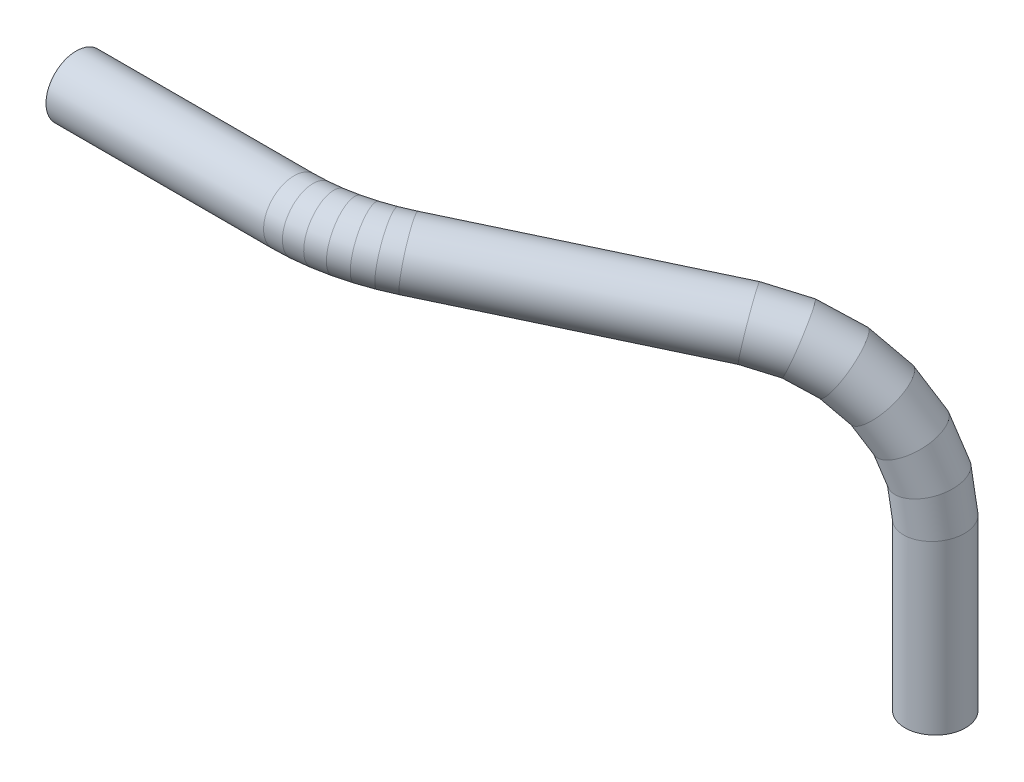
ISO-10303-21;
HEADER;
FILE_DESCRIPTION(('STEP AP214'),'2;1');
FILE_NAME('part.step','',(''),(''),'','','');
FILE_SCHEMA(('AUTOMOTIVE_DESIGN { 1 0 10303 214 1 1 1 1 }'));
ENDSEC;
DATA;
#1=APPLICATION_CONTEXT('core data for automotive mechanical design processes');
#2=APPLICATION_PROTOCOL_DEFINITION('international standard','automotive_design',2000,#1);
#3=PRODUCT_CONTEXT('',#1,'mechanical');
#4=PRODUCT('Part','Part','',(#3));
#5=PRODUCT_RELATED_PRODUCT_CATEGORY('part','',(#4));
#6=PRODUCT_DEFINITION_FORMATION('','',#4);
#7=PRODUCT_DEFINITION_CONTEXT('part definition',#1,'design');
#8=PRODUCT_DEFINITION('design','',#6,#7);
#9=PRODUCT_DEFINITION_SHAPE('','',#8);
#10=(LENGTH_UNIT() NAMED_UNIT(*) SI_UNIT(.MILLI.,.METRE.));
#11=(NAMED_UNIT(*) PLANE_ANGLE_UNIT() SI_UNIT($,.RADIAN.));
#12=(NAMED_UNIT(*) SI_UNIT($,.STERADIAN.) SOLID_ANGLE_UNIT());
#13=UNCERTAINTY_MEASURE_WITH_UNIT(LENGTH_MEASURE(1.E-05),#10,'distance_accuracy_value','');
#14=(GEOMETRIC_REPRESENTATION_CONTEXT(3) GLOBAL_UNCERTAINTY_ASSIGNED_CONTEXT((#13)) GLOBAL_UNIT_ASSIGNED_CONTEXT((#10,
#11,#12)) REPRESENTATION_CONTEXT('',''));
#15=CARTESIAN_POINT('',(0.,0.,0.));
#16=DIRECTION('',(0.,0.,1.));
#17=DIRECTION('',(1.,0.,0.));
#18=AXIS2_PLACEMENT_3D('',#15,#16,#17);
#19=CARTESIAN_POINT('',(125.144076461066,75.7670326342355,0.));
#20=DIRECTION('',(0.,-1.,0.));
#21=DIRECTION('',(0.,0.,-1.));
#22=AXIS2_PLACEMENT_3D('',#19,#20,#21);
#23=CYLINDRICAL_SURFACE('',#22,4.7625);
#24=CARTESIAN_POINT('',(125.144076461066,75.7670326342355,0.));
#25=DIRECTION('',(0.0495415698848754,-0.998178981813304,-0.0344144318491119));
#26=DIRECTION('',(0.819792329710601,0.0603218058926882,-0.569475035345282));
#27=AXIS2_PLACEMENT_3D('',#24,#25,#26);
#28=ELLIPSE('',#27,4.77118842088659,4.7625);
#29=CARTESIAN_POINT('',(129.055460132113,76.0548393360377,-2.7170726946234));
#30=VERTEX_POINT('',#29);
#31=EDGE_CURVE('E66',#30,#30,#28,.F.);
#32=ORIENTED_EDGE('',*,*,#31,.F.);
#33=EDGE_LOOP('',(#32));
#34=FACE_BOUND('',#33,.T.);
#35=CARTESIAN_POINT('',(125.144076461066,49.4,0.));
#36=DIRECTION('',(0.,-1.,0.));
#37=DIRECTION('',(0.,0.,-1.));
#38=AXIS2_PLACEMENT_3D('',#35,#36,#37);
#39=CIRCLE('',#38,4.7625);
#40=CARTESIAN_POINT('',(125.144076461066,49.4,-4.76250000000001));
#41=VERTEX_POINT('',#40);
#42=EDGE_CURVE('E11',#41,#41,#39,.T.);
#43=ORIENTED_EDGE('',*,*,#42,.F.);
#44=EDGE_LOOP('',(#43));
#45=FACE_BOUND('',#44,.T.);
#46=ADVANCED_FACE('F52',(#34,#45),#23,.T.);
#47=CARTESIAN_POINT('',(125.144076461066,75.7670326342355,0.));
#48=DIRECTION('',(0.,-1.,0.));
#49=DIRECTION('',(0.,0.,-1.));
#50=AXIS2_PLACEMENT_3D('',#47,#48,#49);
#51=CYLINDRICAL_SURFACE('',#50,3.8735);
#52=CARTESIAN_POINT('',(125.144076461066,75.7670326342355,0.));
#53=DIRECTION('',(0.0495415698848754,-0.998178981813304,-0.0344144318491119));
#54=DIRECTION('',(0.819792329710601,0.0603218058926882,-0.569475035345282));
#55=AXIS2_PLACEMENT_3D('',#52,#53,#54);
#56=ELLIPSE('',#55,3.88056658232109,3.8735);
#57=CARTESIAN_POINT('',(128.325335180184,76.0011154183679,-2.20988579162703));
#58=VERTEX_POINT('',#57);
#59=EDGE_CURVE('E63',#58,#58,#56,.F.);
#60=ORIENTED_EDGE('',*,*,#59,.T.);
#61=EDGE_LOOP('',(#60));
#62=FACE_BOUND('',#61,.T.);
#63=CARTESIAN_POINT('',(125.144076461066,49.4,0.));
#64=DIRECTION('',(0.,-1.,0.));
#65=DIRECTION('',(0.,0.,-1.));
#66=AXIS2_PLACEMENT_3D('',#63,#64,#65);
#67=CIRCLE('',#66,3.8735);
#68=CARTESIAN_POINT('',(125.144076461066,49.4,-3.87350000000001));
#69=VERTEX_POINT('',#68);
#70=EDGE_CURVE('E60',#69,#69,#67,.T.);
#71=ORIENTED_EDGE('',*,*,#70,.T.);
#72=EDGE_LOOP('',(#71));
#73=FACE_BOUND('',#72,.T.);
#74=ADVANCED_FACE('F54',(#62,#73),#51,.F.);
#75=CARTESIAN_POINT('',(124.57238438886,81.5053145386542,0.397130286814686));
#76=DIRECTION('',(0.0989027075702351,-0.99272255946769,-0.0687035250856597));
#77=DIRECTION('',(0.995073798227724,0.0991369561800745,0.));
#78=AXIS2_PLACEMENT_3D('',#75,#76,#77);
#79=CYLINDRICAL_SURFACE('',#78,3.8735);
#80=CARTESIAN_POINT('',(124.57238438886,81.5053145386542,0.397130286814686));
#81=DIRECTION('',(0.196365897994812,-0.970996160152162,-0.136407078534976));
#82=DIRECTION('',(0.797467406922485,0.239095079350781,-0.553966856343024));
#83=AXIS2_PLACEMENT_3D('',#80,#81,#82);
#84=ELLIPSE('',#83,3.90189581475515,3.8735);
#85=CARTESIAN_POINT('',(127.684019126334,82.4382386281016,-1.76439067146323));
#86=VERTEX_POINT('',#85);
#87=EDGE_CURVE('E71',#86,#86,#84,.T.);
#88=ORIENTED_EDGE('',*,*,#87,.F.);
#89=EDGE_LOOP('',(#88));
#90=FACE_BOUND('',#89,.T.);
#91=ORIENTED_EDGE('',*,*,#59,.F.);
#92=EDGE_LOOP('',(#91));
#93=FACE_BOUND('',#92,.T.);
#94=ADVANCED_FACE('F162',(#90,#93),#79,.F.);
#95=CARTESIAN_POINT('',(124.57238438886,81.5053145386542,0.397130286814686));
#96=DIRECTION('',(0.0989027075702351,-0.99272255946769,-0.0687035250856597));
#97=DIRECTION('',(0.995073798227724,0.0991369561800745,0.));
#98=AXIS2_PLACEMENT_3D('',#95,#96,#97);
#99=CYLINDRICAL_SURFACE('',#98,4.7625);
#100=CARTESIAN_POINT('',(124.57238438886,81.5053145386542,0.397130286814686));
#101=DIRECTION('',(0.196365897994812,-0.970996160152162,-0.136407078534976));
#102=DIRECTION('',(0.797467406922485,0.239095079350781,-0.553966856343024));
#103=AXIS2_PLACEMENT_3D('',#100,#101,#102);
#104=ELLIPSE('',#103,4.79741288699404,4.7625);
#105=CARTESIAN_POINT('',(128.398164803787,82.6523523535485,-2.26047744877291));
#106=VERTEX_POINT('',#105);
#107=EDGE_CURVE('E68',#106,#106,#104,.T.);
#108=ORIENTED_EDGE('',*,*,#107,.T.);
#109=EDGE_LOOP('',(#108));
#110=FACE_BOUND('',#109,.T.);
#111=ORIENTED_EDGE('',*,*,#31,.T.);
#112=EDGE_LOOP('',(#111));
#113=FACE_BOUND('',#112,.T.);
#114=ADVANCED_FACE('F156',(#110,#113),#99,.T.);
#115=CARTESIAN_POINT('',(122.890470702849,86.910732024358,1.56548454078376));
#116=DIRECTION('',(0.290971006128928,-0.935137027211418,-0.202125243179844));
#117=DIRECTION('',(0.954845338969154,0.297103313089707,0.));
#118=AXIS2_PLACEMENT_3D('',#115,#116,#117);
#119=CYLINDRICAL_SURFACE('',#118,4.7625);
#120=CARTESIAN_POINT('',(122.890470702849,86.910732024358,1.56548454078376));
#121=DIRECTION('',(0.381341065875586,-0.885667086060488,-0.264901498950074));
#122=DIRECTION('',(0.727387670005381,0.464320807921769,-0.505285429094309));
#123=AXIS2_PLACEMENT_3D('',#120,#121,#122);
#124=ELLIPSE('',#123,4.79741288699404,4.7625);
#125=CARTESIAN_POINT('',(126.380049684774,89.1382706519813,-0.858578288363592));
#126=VERTEX_POINT('',#125);
#127=EDGE_CURVE('E80',#126,#126,#124,.F.);
#128=ORIENTED_EDGE('',*,*,#127,.F.);
#129=EDGE_LOOP('',(#128));
#130=FACE_BOUND('',#129,.T.);
#131=ORIENTED_EDGE('',*,*,#107,.F.);
#132=EDGE_LOOP('',(#131));
#133=FACE_BOUND('',#132,.T.);
#134=ADVANCED_FACE('F169',(#130,#133),#119,.T.);
#135=CARTESIAN_POINT('',(122.890470702849,86.910732024358,1.56548454078376));
#136=DIRECTION('',(0.290971006128928,-0.935137027211418,-0.202125243179844));
#137=DIRECTION('',(0.954845338969154,0.297103313089707,0.));
#138=AXIS2_PLACEMENT_3D('',#135,#136,#137);
#139=CYLINDRICAL_SURFACE('',#138,3.8735);
#140=CARTESIAN_POINT('',(122.890470702849,86.910732024358,1.56548454078376));
#141=DIRECTION('',(0.381341065875586,-0.885667086060488,-0.264901498950074));
#142=DIRECTION('',(0.727387670005381,0.464320807921769,-0.505285429094309));
#143=AXIS2_PLACEMENT_3D('',#140,#141,#142);
#144=ELLIPSE('',#143,3.90189581475515,3.8735);
#145=CARTESIAN_POINT('',(125.728661608148,88.7224634414917,-0.406086560256087));
#146=VERTEX_POINT('',#145);
#147=EDGE_CURVE('E74',#146,#146,#144,.F.);
#148=ORIENTED_EDGE('',*,*,#147,.T.);
#149=EDGE_LOOP('',(#148));
#150=FACE_BOUND('',#149,.T.);
#151=ORIENTED_EDGE('',*,*,#87,.T.);
#152=EDGE_LOOP('',(#151));
#153=FACE_BOUND('',#152,.T.);
#154=ADVANCED_FACE('F174',(#150,#153),#139,.F.);
#155=CARTESIAN_POINT('',(120.195899313408,91.6697293652146,3.43728924257189));
#156=DIRECTION('',(0.466160751763371,-0.823306365809099,-0.323822144909245));
#157=DIRECTION('',(0.870194192979346,0.492708906460017,0.));
#158=AXIS2_PLACEMENT_3D('',#155,#156,#157);
#159=CYLINDRICAL_SURFACE('',#158,3.8735);
#160=CARTESIAN_POINT('',(120.195899313408,91.6697293652146,3.43728924257189));
#161=DIRECTION('',(0.544195523352243,-0.748962519323615,-0.37802959806317));
#162=DIRECTION('',(0.61511386211202,0.662612363790794,-0.427293566519801));
#163=AXIS2_PLACEMENT_3D('',#160,#161,#162);
#164=ELLIPSE('',#163,3.90189581475515,3.8735);
#165=CARTESIAN_POINT('',(122.596009517581,94.2551737742949,1.77003426369648));
#166=VERTEX_POINT('',#165);
#167=EDGE_CURVE('E82',#166,#166,#164,.T.);
#168=ORIENTED_EDGE('',*,*,#167,.F.);
#169=EDGE_LOOP('',(#168));
#170=FACE_BOUND('',#169,.T.);
#171=ORIENTED_EDGE('',*,*,#147,.F.);
#172=EDGE_LOOP('',(#171));
#173=FACE_BOUND('',#172,.T.);
#174=ADVANCED_FACE('F177',(#170,#173),#159,.F.);
#175=CARTESIAN_POINT('',(120.195899313408,91.6697293652146,3.43728924257189));
#176=DIRECTION('',(0.466160751763371,-0.823306365809099,-0.323822144909245));
#177=DIRECTION('',(0.870194192979346,0.492708906460017,0.));
#178=AXIS2_PLACEMENT_3D('',#175,#176,#177);
#179=CYLINDRICAL_SURFACE('',#178,4.7625);
#180=CARTESIAN_POINT('',(120.195899313408,91.6697293652146,3.43728924257189));
#181=DIRECTION('',(0.544195523352243,-0.748962519323615,-0.37802959806317));
#182=DIRECTION('',(0.61511386211202,0.662612363790794,-0.427293566519801));
#183=AXIS2_PLACEMENT_3D('',#180,#181,#182);
#184=ELLIPSE('',#183,4.79741288699404,4.7625);
#185=CARTESIAN_POINT('',(123.146854482473,94.8485544583461,1.38738558002015));
#186=VERTEX_POINT('',#185);
#187=EDGE_CURVE('E79',#186,#186,#184,.T.);
#188=ORIENTED_EDGE('',*,*,#187,.T.);
#189=EDGE_LOOP('',(#188));
#190=FACE_BOUND('',#189,.T.);
#191=ORIENTED_EDGE('',*,*,#127,.T.);
#192=EDGE_LOOP('',(#191));
#193=FACE_BOUND('',#192,.T.);
#194=ADVANCED_FACE('F182',(#190,#193),#179,.T.);
#195=CARTESIAN_POINT('',(116.644976054613,95.5062481678031,5.90396534458491));
#196=DIRECTION('',(0.614309593822825,-0.663717612447518,-0.42673487537838));
#197=DIRECTION('',(0.733895023438462,0.679262905340972,0.));
#198=AXIS2_PLACEMENT_3D('',#195,#196,#197);
#199=CYLINDRICAL_SURFACE('',#198,4.7625);
#200=CARTESIAN_POINT('',(116.644976054613,95.5062481678031,5.90396534458491));
#201=DIRECTION('',(0.675482461218463,-0.568812374661751,-0.469229077336334));
#202=DIRECTION('',(0.467158726328892,0.822467313898649,-0.324515395602594));
#203=AXIS2_PLACEMENT_3D('',#200,#201,#202);
#204=ELLIPSE('',#203,4.79741288699404,4.7625);
#205=CARTESIAN_POINT('',(118.886129348575,99.4519634586319,4.34713100369305));
#206=VERTEX_POINT('',#205);
#207=EDGE_CURVE('E83',#206,#206,#204,.F.);
#208=ORIENTED_EDGE('',*,*,#207,.F.);
#209=EDGE_LOOP('',(#208));
#210=FACE_BOUND('',#209,.T.);
#211=ORIENTED_EDGE('',*,*,#187,.F.);
#212=EDGE_LOOP('',(#211));
#213=FACE_BOUND('',#212,.T.);
#214=ADVANCED_FACE('F184',(#210,#213),#199,.T.);
#215=CARTESIAN_POINT('',(116.644976054613,95.5062481678031,5.90396534458491));
#216=DIRECTION('',(0.614309593822825,-0.663717612447518,-0.42673487537838));
#217=DIRECTION('',(0.733895023438462,0.679262905340972,0.));
#218=AXIS2_PLACEMENT_3D('',#215,#216,#217);
#219=CYLINDRICAL_SURFACE('',#218,3.8735);
#220=CARTESIAN_POINT('',(116.644976054613,95.5062481678031,5.90396534458491));
#221=DIRECTION('',(0.675482461218463,-0.568812374661751,-0.469229077336334));
#222=DIRECTION('',(0.467158726328892,0.822467313898649,-0.324515395602594));
#223=AXIS2_PLACEMENT_3D('',#220,#221,#222);
#224=ELLIPSE('',#223,3.90189581475515,3.8735);
#225=CARTESIAN_POINT('',(118.467780733703,98.7154299376772,4.63774008065953));
#226=VERTEX_POINT('',#225);
#227=EDGE_CURVE('E84',#226,#226,#224,.F.);
#228=ORIENTED_EDGE('',*,*,#227,.T.);
#229=EDGE_LOOP('',(#228));
#230=FACE_BOUND('',#229,.T.);
#231=ORIENTED_EDGE('',*,*,#167,.T.);
#232=EDGE_LOOP('',(#231));
#233=FACE_BOUND('',#232,.T.);
#234=ADVANCED_FACE('F186',(#230,#233),#219,.F.);
#235=CARTESIAN_POINT('',(112.443681745484,98.1977408782765,8.82242668958426));
#236=DIRECTION('',(0.726823761729829,-0.465628140414698,-0.504893705881596));
#237=DIRECTION('',(-0.570513951626965,0.,-0.821287909931094));
#238=AXIS2_PLACEMENT_3D('',#235,#236,#237);
#239=CYLINDRICAL_SURFACE('',#238,3.8735);
#240=CARTESIAN_POINT('',(112.443681745484,98.1977408782765,8.82242668958426));
#241=DIRECTION('',(0.767586228834276,-0.355666743963573,-0.533209666587474));
#242=DIRECTION('',(0.292104796781842,0.934612843501709,-0.202912839560951));
#243=AXIS2_PLACEMENT_3D('',#240,#241,#242);
#244=ELLIPSE('',#243,3.90189581475515,3.8735);
#245=CARTESIAN_POINT('',(113.583444229517,101.844502820752,8.0306819301413));
#246=VERTEX_POINT('',#245);
#247=EDGE_CURVE('E90',#246,#246,#244,.T.);
#248=ORIENTED_EDGE('',*,*,#247,.F.);
#249=EDGE_LOOP('',(#248));
#250=FACE_BOUND('',#249,.T.);
#251=ORIENTED_EDGE('',*,*,#227,.F.);
#252=EDGE_LOOP('',(#251));
#253=FACE_BOUND('',#252,.T.);
#254=ADVANCED_FACE('F194',(#250,#253),#239,.F.);
#255=CARTESIAN_POINT('',(112.443681745484,98.1977408782765,8.82242668958426));
#256=DIRECTION('',(0.726823761729829,-0.465628140414698,-0.504893705881596));
#257=DIRECTION('',(-0.570513951626965,0.,-0.821287909931094));
#258=AXIS2_PLACEMENT_3D('',#255,#256,#257);
#259=CYLINDRICAL_SURFACE('',#258,4.7625);
#260=CARTESIAN_POINT('',(112.443681745484,98.1977408782765,8.82242668958426));
#261=DIRECTION('',(0.767586228834276,-0.355666743963573,-0.533209666587474));
#262=DIRECTION('',(0.292104796781842,0.934612843501709,-0.202912839560951));
#263=AXIS2_PLACEMENT_3D('',#260,#261,#262);
#264=ELLIPSE('',#263,4.79741288699404,4.7625);
#265=CARTESIAN_POINT('',(113.845029061918,102.681464578042,7.848970018138));
#266=VERTEX_POINT('',#265);
#267=EDGE_CURVE('E88',#266,#266,#264,.T.);
#268=ORIENTED_EDGE('',*,*,#267,.T.);
#269=EDGE_LOOP('',(#268));
#270=FACE_BOUND('',#269,.T.);
#271=ORIENTED_EDGE('',*,*,#207,.T.);
#272=EDGE_LOOP('',(#271));
#273=FACE_BOUND('',#272,.T.);
#274=ADVANCED_FACE('F197',(#270,#273),#259,.T.);
#275=CARTESIAN_POINT('',(107.835723720612,99.5880802495825,12.023380106665));
#276=DIRECTION('',(0.7971765696712,-0.240528660355417,-0.553764824013666));
#277=DIRECTION('',(-0.570513951626964,0.,-0.821287909931094));
#278=AXIS2_PLACEMENT_3D('',#275,#276,#277);
#279=CYLINDRICAL_SURFACE('',#278,4.7625);
#280=CARTESIAN_POINT('',(107.835723720612,99.5880802495825,12.023380106665));
#281=DIRECTION('',(0.807641064076134,-0.181539772757083,-0.561034065387545));
#282=DIRECTION('',(0.14909642053703,0.983383603131203,-0.103570973133106));
#283=AXIS2_PLACEMENT_3D('',#280,#281,#282);
#284=ELLIPSE('',#283,4.77118842088659,4.7625);
#285=CARTESIAN_POINT('',(108.547090835874,104.279988710132,11.5292234789124));
#286=VERTEX_POINT('',#285);
#287=EDGE_CURVE('E91',#286,#286,#284,.F.);
#288=ORIENTED_EDGE('',*,*,#287,.F.);
#289=EDGE_LOOP('',(#288));
#290=FACE_BOUND('',#289,.T.);
#291=ORIENTED_EDGE('',*,*,#267,.F.);
#292=EDGE_LOOP('',(#291));
#293=FACE_BOUND('',#292,.T.);
#294=ADVANCED_FACE('F199',(#290,#293),#279,.T.);
#295=CARTESIAN_POINT('',(107.835723720612,99.5880802495825,12.023380106665));
#296=DIRECTION('',(0.7971765696712,-0.240528660355417,-0.553764824013666));
#297=DIRECTION('',(-0.570513951626964,0.,-0.821287909931094));
#298=AXIS2_PLACEMENT_3D('',#295,#296,#297);
#299=CYLINDRICAL_SURFACE('',#298,3.8735);
#300=CARTESIAN_POINT('',(107.835723720612,99.5880802495825,12.023380106665));
#301=DIRECTION('',(0.807641064076134,-0.181539772757083,-0.561034065387545));
#302=DIRECTION('',(0.14909642053703,0.983383603131203,-0.103570973133106));
#303=AXIS2_PLACEMENT_3D('',#300,#301,#302);
#304=ELLIPSE('',#303,3.88056658232109,3.8735);
#305=CARTESIAN_POINT('',(108.414302307692,103.404165797496,11.6214660494262));
#306=VERTEX_POINT('',#305);
#307=EDGE_CURVE('E89',#306,#306,#304,.F.);
#308=ORIENTED_EDGE('',*,*,#307,.T.);
#309=EDGE_LOOP('',(#308));
#310=FACE_BOUND('',#309,.T.);
#311=ORIENTED_EDGE('',*,*,#247,.T.);
#312=EDGE_LOOP('',(#311));
#313=FACE_BOUND('',#312,.T.);
#314=ADVANCED_FACE('F202',(#310,#313),#299,.F.);
#315=CARTESIAN_POINT('',(76.2429736647559,104.312075286872,33.9695264692015));
#316=DIRECTION('',(0.815164100349059,-0.121889710703152,-0.566260000288571));
#317=DIRECTION('',(-0.570513951626965,0.,-0.821287909931094));
#318=AXIS2_PLACEMENT_3D('',#315,#316,#317);
#319=CYLINDRICAL_SURFACE('',#318,3.8735);
#320=CARTESIAN_POINT('',(76.2429736647559,104.312075286872,33.9695264692015));
#321=DIRECTION('',(0.829802364068987,-0.117434253244735,-0.545561392283556));
#322=DIRECTION('',(0.558057377502995,0.174618641189141,0.811221482434814));
#323=AXIS2_PLACEMENT_3D('',#320,#321,#322);
#324=ELLIPSE('',#323,3.87478364266344,3.8735);
#325=CARTESIAN_POINT('',(78.4053252627722,104.988684741455,37.1128341999171));
#326=VERTEX_POINT('',#325);
#327=EDGE_CURVE('E100',#326,#326,#324,.T.);
#328=ORIENTED_EDGE('',*,*,#327,.F.);
#329=EDGE_LOOP('',(#328));
#330=FACE_BOUND('',#329,.T.);
#331=ORIENTED_EDGE('',*,*,#307,.F.);
#332=EDGE_LOOP('',(#331));
#333=FACE_BOUND('',#332,.T.);
#334=ADVANCED_FACE('F208',(#330,#333),#319,.F.);
#335=CARTESIAN_POINT('',(76.2429736647559,104.312075286872,33.9695264692015));
#336=DIRECTION('',(0.815164100349059,-0.121889710703152,-0.566260000288571));
#337=DIRECTION('',(-0.570513951626965,0.,-0.821287909931094));
#338=AXIS2_PLACEMENT_3D('',#335,#336,#337);
#339=CYLINDRICAL_SURFACE('',#338,4.7625);
#340=CARTESIAN_POINT('',(76.2429736647559,104.312075286872,33.9695264692015));
#341=DIRECTION('',(0.829802364068987,-0.117434253244735,-0.545561392283556));
#342=DIRECTION('',(0.558057377502995,0.174618641189141,0.811221482434814));
#343=AXIS2_PLACEMENT_3D('',#340,#341,#342);
#344=ELLIPSE('',#343,4.76407824917636,4.7625);
#345=CARTESIAN_POINT('',(78.9016026787103,105.143972157262,37.8342490889338));
#346=VERTEX_POINT('',#345);
#347=EDGE_CURVE('E94',#346,#346,#344,.T.);
#348=ORIENTED_EDGE('',*,*,#347,.T.);
#349=EDGE_LOOP('',(#348));
#350=FACE_BOUND('',#349,.T.);
#351=ORIENTED_EDGE('',*,*,#287,.T.);
#352=EDGE_LOOP('',(#351));
#353=FACE_BOUND('',#352,.T.);
#354=ADVANCED_FACE('F213',(#350,#353),#339,.T.);
#355=CARTESIAN_POINT('',(74.1585261057256,104.590945705292,35.2650678426604));
#356=DIRECTION('',(0.843890832076448,-0.112900988284524,-0.524501315900825));
#357=DIRECTION('',(-0.527876429325819,0.,-0.849321185042634));
#358=AXIS2_PLACEMENT_3D('',#355,#356,#357);
#359=CYLINDRICAL_SURFACE('',#358,4.7625);
#360=CARTESIAN_POINT('',(74.1585261057256,104.590945705292,35.2650678426604));
#361=DIRECTION('',(0.870381413464887,-0.103613099701714,-0.481352802697842));
#362=DIRECTION('',(0.492378101762116,0.183157853383606,0.850891888343663));
#363=AXIS2_PLACEMENT_3D('',#360,#361,#362);
#364=ELLIPSE('',#363,4.7688182310427,4.7625);
#365=CARTESIAN_POINT('',(76.506587773975,105.464392215666,39.32281659244));
#366=VERTEX_POINT('',#365);
#367=EDGE_CURVE('E101',#366,#366,#364,.F.);
#368=ORIENTED_EDGE('',*,*,#367,.F.);
#369=EDGE_LOOP('',(#368));
#370=FACE_BOUND('',#369,.T.);
#371=ORIENTED_EDGE('',*,*,#347,.F.);
#372=EDGE_LOOP('',(#371));
#373=FACE_BOUND('',#372,.T.);
#374=ADVANCED_FACE('F216',(#370,#373),#359,.T.);
#375=CARTESIAN_POINT('',(74.1585261057256,104.590945705292,35.2650678426604));
#376=DIRECTION('',(0.843890832076448,-0.112900988284524,-0.524501315900825));
#377=DIRECTION('',(-0.527876429325819,0.,-0.849321185042634));
#378=AXIS2_PLACEMENT_3D('',#375,#376,#377);
#379=CYLINDRICAL_SURFACE('',#378,3.8735);
#380=CARTESIAN_POINT('',(74.1585261057256,104.590945705292,35.2650678426604));
#381=DIRECTION('',(0.870381413464887,-0.103613099701714,-0.481352802697842));
#382=DIRECTION('',(0.492378101762116,0.183157853383606,0.850891888343663));
#383=AXIS2_PLACEMENT_3D('',#380,#381,#382);
#384=ELLIPSE('',#383,3.87863882791473,3.8735);
#385=CARTESIAN_POINT('',(76.0682829292351,105.301348867063,38.5653701591478));
#386=VERTEX_POINT('',#385);
#387=EDGE_CURVE('E98',#386,#386,#384,.F.);
#388=ORIENTED_EDGE('',*,*,#387,.T.);
#389=EDGE_LOOP('',(#388));
#390=FACE_BOUND('',#389,.T.);
#391=ORIENTED_EDGE('',*,*,#327,.T.);
#392=EDGE_LOOP('',(#391));
#393=FACE_BOUND('',#392,.T.);
#394=ADVANCED_FACE('F222',(#390,#393),#379,.F.);
#395=CARTESIAN_POINT('',(71.9489095135881,104.823254972165,36.3443012313378));
#396=DIRECTION('',(0.894565649507745,-0.0940506560944733,-0.436928796040024));
#397=DIRECTION('',(-0.43887414380704,0.,-0.898548543985041));
#398=AXIS2_PLACEMENT_3D('',#395,#396,#397);
#399=CYLINDRICAL_SURFACE('',#398,3.8735);
#400=CARTESIAN_POINT('',(71.9489095135881,104.823254972165,36.3443012313378));
#401=DIRECTION('',(0.916379456575282,-0.0842389961211887,-0.391347011103043));
#402=DIRECTION('',(0.400310743756386,0.192837406170092,0.895859946205209));
#403=AXIS2_PLACEMENT_3D('',#400,#401,#402);
#404=ELLIPSE('',#403,3.87863882791473,3.8735);
#405=CARTESIAN_POINT('',(73.501570307553,105.571201623211,39.8190184030629));
#406=VERTEX_POINT('',#405);
#407=EDGE_CURVE('E104',#406,#406,#404,.T.);
#408=ORIENTED_EDGE('',*,*,#407,.F.);
#409=EDGE_LOOP('',(#408));
#410=FACE_BOUND('',#409,.T.);
#411=ORIENTED_EDGE('',*,*,#387,.F.);
#412=EDGE_LOOP('',(#411));
#413=FACE_BOUND('',#412,.T.);
#414=ADVANCED_FACE('F221',(#410,#413),#399,.F.);
#415=CARTESIAN_POINT('',(71.9489095135881,104.823254972165,36.3443012313378));
#416=DIRECTION('',(0.894565649507745,-0.0940506560944733,-0.436928796040024));
#417=DIRECTION('',(-0.43887414380704,0.,-0.898548543985041));
#418=AXIS2_PLACEMENT_3D('',#415,#416,#417);
#419=CYLINDRICAL_SURFACE('',#418,4.7625);
#420=CARTESIAN_POINT('',(71.9489095135881,104.823254972165,36.3443012313378));
#421=DIRECTION('',(0.916379456575282,-0.0842389961211887,-0.391347011103043));
#422=DIRECTION('',(0.400310743756386,0.192837406170092,0.895859946205209));
#423=AXIS2_PLACEMENT_3D('',#420,#421,#422);
#424=ELLIPSE('',#423,4.7688182310427,4.7625);
#425=CARTESIAN_POINT('',(73.8579186864958,105.742861510336,40.6164944752622));
#426=VERTEX_POINT('',#425);
#427=EDGE_CURVE('E105',#426,#426,#424,.T.);
#428=ORIENTED_EDGE('',*,*,#427,.T.);
#429=EDGE_LOOP('',(#428));
#430=FACE_BOUND('',#429,.T.);
#431=ORIENTED_EDGE('',*,*,#367,.T.);
#432=EDGE_LOOP('',(#431));
#433=FACE_BOUND('',#432,.T.);
#434=ADVANCED_FACE('F226',(#430,#433),#419,.T.);
#435=CARTESIAN_POINT('',(69.6375286298237,105.006542417007,37.1957951594978));
#436=DIRECTION('',(0.935765032224084,-0.0742041188162665,-0.344728230954994));
#437=DIRECTION('',(-0.345681248557837,0.,-0.938351999196194));
#438=AXIS2_PLACEMENT_3D('',#435,#436,#437);
#439=CYLINDRICAL_SURFACE('',#438,4.7625);
#440=CARTESIAN_POINT('',(69.6375286298237,105.006542417007,37.1957951594978));
#441=DIRECTION('',(0.952671008362557,-0.063972614697623,-0.297195986504225));
#442=DIRECTION('',(0.304003206932871,0.200474383038437,0.931338859878556));
#443=AXIS2_PLACEMENT_3D('',#440,#441,#442);
#444=ELLIPSE('',#443,4.7688182310427,4.7625);
#445=CARTESIAN_POINT('',(71.0872646653407,105.962568309698,41.6371808937652));
#446=VERTEX_POINT('',#445);
#447=EDGE_CURVE('E108',#446,#446,#444,.F.);
#448=ORIENTED_EDGE('',*,*,#447,.F.);
#449=EDGE_LOOP('',(#448));
#450=FACE_BOUND('',#449,.T.);
#451=ORIENTED_EDGE('',*,*,#427,.F.);
#452=EDGE_LOOP('',(#451));
#453=FACE_BOUND('',#452,.T.);
#454=ADVANCED_FACE('F234',(#450,#453),#439,.T.);
#455=CARTESIAN_POINT('',(69.6375286298237,105.006542417007,37.1957951594978));
#456=DIRECTION('',(0.935765032224084,-0.0742041188162665,-0.344728230954994));
#457=DIRECTION('',(-0.345681248557837,0.,-0.938351999196194));
#458=AXIS2_PLACEMENT_3D('',#455,#456,#457);
#459=CYLINDRICAL_SURFACE('',#458,3.8735);
#460=CARTESIAN_POINT('',(69.6375286298237,105.006542417007,37.1957951594978));
#461=DIRECTION('',(0.952671008362557,-0.063972614697623,-0.297195986504225));
#462=DIRECTION('',(0.304003206932871,0.200474383038437,0.931338859878556));
#463=AXIS2_PLACEMENT_3D('',#460,#461,#462);
#464=ELLIPSE('',#463,3.87863882791473,3.8735);
#465=CARTESIAN_POINT('',(70.8166472720442,105.784110143062,40.8081222233686));
#466=VERTEX_POINT('',#465);
#467=EDGE_CURVE('E106',#466,#466,#464,.F.);
#468=ORIENTED_EDGE('',*,*,#467,.T.);
#469=EDGE_LOOP('',(#468));
#470=FACE_BOUND('',#469,.T.);
#471=ORIENTED_EDGE('',*,*,#407,.T.);
#472=EDGE_LOOP('',(#471));
#473=FACE_BOUND('',#472,.T.);
#474=ADVANCED_FACE('F240',(#470,#473),#459,.F.);
#475=CARTESIAN_POINT('',(67.2488661055131,105.138866619174,37.810530417504));
#476=DIRECTION('',(0.967052587366605,-0.0535715953068585,-0.248876229165891));
#477=DIRECTION('',(-0.249234126616176,0.,-0.968443261182539));
#478=AXIS2_PLACEMENT_3D('',#475,#476,#477);
#479=CYLINDRICAL_SURFACE('',#478,3.8735);
#480=CARTESIAN_POINT('',(67.2488661055131,105.138866619174,37.810530417504));
#481=DIRECTION('',(0.978871660784824,-0.0430286213688375,-0.199896997114656));
#482=DIRECTION('',(0.204475601753265,0.205987891462031,0.956952828962153));
#483=AXIS2_PLACEMENT_3D('',#480,#481,#482);
#484=ELLIPSE('',#483,3.87863882791473,3.8735);
#485=CARTESIAN_POINT('',(68.0419531138346,105.937819253079,41.5222048163994));
#486=VERTEX_POINT('',#485);
#487=EDGE_CURVE('E114',#486,#486,#484,.T.);
#488=ORIENTED_EDGE('',*,*,#487,.F.);
#489=EDGE_LOOP('',(#488));
#490=FACE_BOUND('',#489,.T.);
#491=ORIENTED_EDGE('',*,*,#467,.F.);
#492=EDGE_LOOP('',(#491));
#493=FACE_BOUND('',#492,.T.);
#494=ADVANCED_FACE('F238',(#490,#493),#479,.F.);
#495=CARTESIAN_POINT('',(67.2488661055131,105.138866619174,37.810530417504));
#496=DIRECTION('',(0.967052587366605,-0.0535715953068585,-0.248876229165891));
#497=DIRECTION('',(-0.249234126616176,0.,-0.968443261182539));
#498=AXIS2_PLACEMENT_3D('',#495,#496,#497);
#499=CYLINDRICAL_SURFACE('',#498,4.7625);
#500=CARTESIAN_POINT('',(67.2488661055131,105.138866619174,37.810530417504));
#501=DIRECTION('',(0.978871660784824,-0.0430286213688375,-0.199896997114656));
#502=DIRECTION('',(0.204475601753265,0.205987891462031,0.956952828962153));
#503=AXIS2_PLACEMENT_3D('',#500,#501,#502);
#504=ELLIPSE('',#503,4.7688182310427,4.7625);
#505=CARTESIAN_POINT('',(68.2239730829575,106.121185431352,42.3740645145066));
#506=VERTEX_POINT('',#505);
#507=EDGE_CURVE('E109',#506,#506,#504,.T.);
#508=ORIENTED_EDGE('',*,*,#507,.T.);
#509=EDGE_LOOP('',(#508));
#510=FACE_BOUND('',#509,.T.);
#511=ORIENTED_EDGE('',*,*,#447,.T.);
#512=EDGE_LOOP('',(#511));
#513=FACE_BOUND('',#512,.T.);
#514=ADVANCED_FACE('F243',(#510,#513),#499,.T.);
#515=CARTESIAN_POINT('',(64.8082231757501,105.218825971821,38.1819955952574));
#516=DIRECTION('',(0.988096910318657,-0.0323716297609933,-0.150388076007843));
#517=DIRECTION('',(-0.150466935510015,0.,-0.988615042025067));
#518=AXIS2_PLACEMENT_3D('',#515,#516,#517);
#519=CYLINDRICAL_SURFACE('',#518,4.7625);
#520=CARTESIAN_POINT('',(64.8082231757501,105.218825971821,38.1819955952574));
#521=DIRECTION('',(0.99470389080993,-0.0216288594859124,-0.100480655078112));
#522=DIRECTION('',(0.102782146346474,0.209319531155747,0.972430544701857));
#523=AXIS2_PLACEMENT_3D('',#520,#521,#522);
#524=ELLIPSE('',#523,4.7688182310427,4.7625);
#525=CARTESIAN_POINT('',(65.2983725490729,106.21703276811,42.8193401052545));
#526=VERTEX_POINT('',#525);
#527=EDGE_CURVE('E120',#526,#526,#524,.F.);
#528=ORIENTED_EDGE('',*,*,#527,.F.);
#529=EDGE_LOOP('',(#528));
#530=FACE_BOUND('',#529,.T.);
#531=ORIENTED_EDGE('',*,*,#507,.F.);
#532=EDGE_LOOP('',(#531));
#533=FACE_BOUND('',#532,.T.);
#534=ADVANCED_FACE('F250',(#530,#533),#519,.T.);
#535=CARTESIAN_POINT('',(64.8082231757501,105.218825971821,38.1819955952574));
#536=DIRECTION('',(0.988096910318657,-0.0323716297609933,-0.150388076007843));
#537=DIRECTION('',(-0.150466935510015,0.,-0.988615042025067));
#538=AXIS2_PLACEMENT_3D('',#535,#536,#537);
#539=CYLINDRICAL_SURFACE('',#538,3.8735);
#540=CARTESIAN_POINT('',(64.8082231757501,105.218825971821,38.1819955952574));
#541=DIRECTION('',(0.99470389080993,-0.0216288594859124,-0.100480655078112));
#542=DIRECTION('',(0.102782146346474,0.209319531155747,0.972430544701857));
#543=AXIS2_PLACEMENT_3D('',#540,#541,#542);
#544=ELLIPSE('',#543,3.87863882791473,3.8735);
#545=CARTESIAN_POINT('',(65.206877999386,106.030700832802,41.9537024633883));
#546=VERTEX_POINT('',#545);
#547=EDGE_CURVE('E111',#546,#546,#544,.F.);
#548=ORIENTED_EDGE('',*,*,#547,.T.);
#549=EDGE_LOOP('',(#548));
#550=FACE_BOUND('',#549,.T.);
#551=ORIENTED_EDGE('',*,*,#487,.T.);
#552=EDGE_LOOP('',(#551));
#553=FACE_BOUND('',#552,.T.);
#554=ADVANCED_FACE('F251',(#550,#553),#539,.F.);
#555=CARTESIAN_POINT('',(62.3414516634348,105.245573528022,38.3062560524749));
#556=DIRECTION('',(0.998675095015874,-0.0108287768433639,-0.0503069795069389));
#557=DIRECTION('',(-0.0503099293251447,0.,-0.99873365368916));
#558=AXIS2_PLACEMENT_3D('',#555,#556,#557);
#559=CYLINDRICAL_SURFACE('',#558,3.8735);
#560=CARTESIAN_POINT('',(62.3414516634348,105.245573528022,38.3062560524749));
#561=DIRECTION('',(0.999668718880378,-0.00541618270075114,-0.0251618253911568));
#562=DIRECTION('',(-0.0257381524601704,-0.210364299848665,-0.977284200658702));
#563=AXIS2_PLACEMENT_3D('',#560,#561,#562);
#564=ELLIPSE('',#563,3.87478364266343,3.8735);
#565=CARTESIAN_POINT('',(62.2417218912898,104.430457379968,34.5194912175291));
#566=VERTEX_POINT('',#565);
#567=EDGE_CURVE('E124',#566,#566,#564,.T.);
#568=ORIENTED_EDGE('',*,*,#567,.F.);
#569=EDGE_LOOP('',(#568));
#570=FACE_BOUND('',#569,.T.);
#571=ORIENTED_EDGE('',*,*,#547,.F.);
#572=EDGE_LOOP('',(#571));
#573=FACE_BOUND('',#572,.T.);
#574=ADVANCED_FACE('F258',(#570,#573),#559,.F.);
#575=CARTESIAN_POINT('',(62.3414516634348,105.245573528022,38.3062560524749));
#576=DIRECTION('',(0.998675095015874,-0.0108287768433639,-0.0503069795069389));
#577=DIRECTION('',(-0.0503099293251447,0.,-0.99873365368916));
#578=AXIS2_PLACEMENT_3D('',#575,#576,#577);
#579=CYLINDRICAL_SURFACE('',#578,4.7625);
#580=CARTESIAN_POINT('',(62.3414516634348,105.245573528022,38.3062560524749));
#581=DIRECTION('',(0.999668718880378,-0.00541618270075114,-0.0251618253911568));
#582=DIRECTION('',(-0.0257381524601704,-0.210364299848665,-0.977284200658702));
#583=AXIS2_PLACEMENT_3D('',#580,#581,#582);
#584=ELLIPSE('',#583,4.76407824917635,4.7625);
#585=CARTESIAN_POINT('',(62.2188330911253,104.243381542709,33.6503976488531));
#586=VERTEX_POINT('',#585);
#587=EDGE_CURVE('E123',#586,#586,#584,.T.);
#588=ORIENTED_EDGE('',*,*,#587,.T.);
#589=EDGE_LOOP('',(#588));
#590=FACE_BOUND('',#589,.T.);
#591=ORIENTED_EDGE('',*,*,#527,.T.);
#592=EDGE_LOOP('',(#591));
#593=FACE_BOUND('',#592,.T.);
#594=ADVANCED_FACE('F261',(#590,#593),#579,.T.);
#595=CARTESIAN_POINT('',(75.8118358450385,105.245573528022,38.3062560524749));
#596=DIRECTION('',(-1.,0.,0.));
#597=DIRECTION('',(0.,0.,1.));
#598=AXIS2_PLACEMENT_3D('',#595,#596,#597);
#599=CYLINDRICAL_SURFACE('',#598,3.8735);
#600=CARTESIAN_POINT('',(28.2,105.245573528022,38.3062560524749));
#601=DIRECTION('',(1.,0.,0.));
#602=DIRECTION('',(0.,0.,-1.));
#603=AXIS2_PLACEMENT_3D('',#600,#601,#602);
#604=CIRCLE('',#603,3.8735);
#605=CARTESIAN_POINT('',(28.2,105.245573528022,34.4327560524749));
#606=VERTEX_POINT('',#605);
#607=EDGE_CURVE('E122',#606,#606,#604,.T.);
#608=ORIENTED_EDGE('',*,*,#607,.F.);
#609=EDGE_LOOP('',(#608));
#610=FACE_BOUND('',#609,.T.);
#611=ORIENTED_EDGE('',*,*,#567,.T.);
#612=EDGE_LOOP('',(#611));
#613=FACE_BOUND('',#612,.T.);
#614=ADVANCED_FACE('F262',(#610,#613),#599,.F.);
#615=CARTESIAN_POINT('',(75.8118358450385,105.245573528022,38.3062560524749));
#616=DIRECTION('',(-1.,0.,0.));
#617=DIRECTION('',(0.,0.,1.));
#618=AXIS2_PLACEMENT_3D('',#615,#616,#617);
#619=CYLINDRICAL_SURFACE('',#618,4.7625);
#620=CARTESIAN_POINT('',(28.2,105.245573528022,38.3062560524749));
#621=DIRECTION('',(1.,0.,0.));
#622=DIRECTION('',(0.,0.,-1.));
#623=AXIS2_PLACEMENT_3D('',#620,#621,#622);
#624=CIRCLE('',#623,4.7625);
#625=CARTESIAN_POINT('',(28.2,105.245573528022,33.5437560524749));
#626=VERTEX_POINT('',#625);
#627=EDGE_CURVE('E119',#626,#626,#624,.T.);
#628=ORIENTED_EDGE('',*,*,#627,.T.);
#629=EDGE_LOOP('',(#628));
#630=FACE_BOUND('',#629,.T.);
#631=ORIENTED_EDGE('',*,*,#587,.F.);
#632=EDGE_LOOP('',(#631));
#633=FACE_BOUND('',#632,.T.);
#634=ADVANCED_FACE('F267',(#630,#633),#619,.T.);
#635=CARTESIAN_POINT('',(28.2,105.245573528022,38.3062560524749));
#636=DIRECTION('',(1.,0.,0.));
#637=DIRECTION('',(0.,0.,-1.));
#638=AXIS2_PLACEMENT_3D('',#635,#636,#637);
#639=PLANE('',#638);
#640=ORIENTED_EDGE('',*,*,#607,.T.);
#641=EDGE_LOOP('',(#640));
#642=FACE_BOUND('',#641,.T.);
#643=ORIENTED_EDGE('',*,*,#627,.F.);
#644=EDGE_LOOP('',(#643));
#645=FACE_BOUND('',#644,.T.);
#646=ADVANCED_FACE('F275',(#642,#645),#639,.F.);
#647=CARTESIAN_POINT('',(125.144076461066,49.4,0.));
#648=DIRECTION('',(0.,-1.,0.));
#649=DIRECTION('',(0.,0.,-1.));
#650=AXIS2_PLACEMENT_3D('',#647,#648,#649);
#651=PLANE('',#650);
#652=ORIENTED_EDGE('',*,*,#70,.F.);
#653=EDGE_LOOP('',(#652));
#654=FACE_BOUND('',#653,.T.);
#655=ORIENTED_EDGE('',*,*,#42,.T.);
#656=EDGE_LOOP('',(#655));
#657=FACE_BOUND('',#656,.T.);
#658=ADVANCED_FACE('F276',(#654,#657),#651,.T.);
#659=CLOSED_SHELL('',(#46,#74,#94,#114,#134,#154,#174,#194,#214,#234,#254,#274,#294,#314,#334,
#354,#374,#394,#414,#434,#454,#474,#494,#514,#534,#554,#574,#594,#614,#634,#646,#658));
#660=MANIFOLD_SOLID_BREP('B2',#659);
#661=ADVANCED_BREP_SHAPE_REPRESENTATION('',(#18,#660),#14);
#662=SHAPE_DEFINITION_REPRESENTATION(#9,#661);
ENDSEC;
END-ISO-10303-21;
